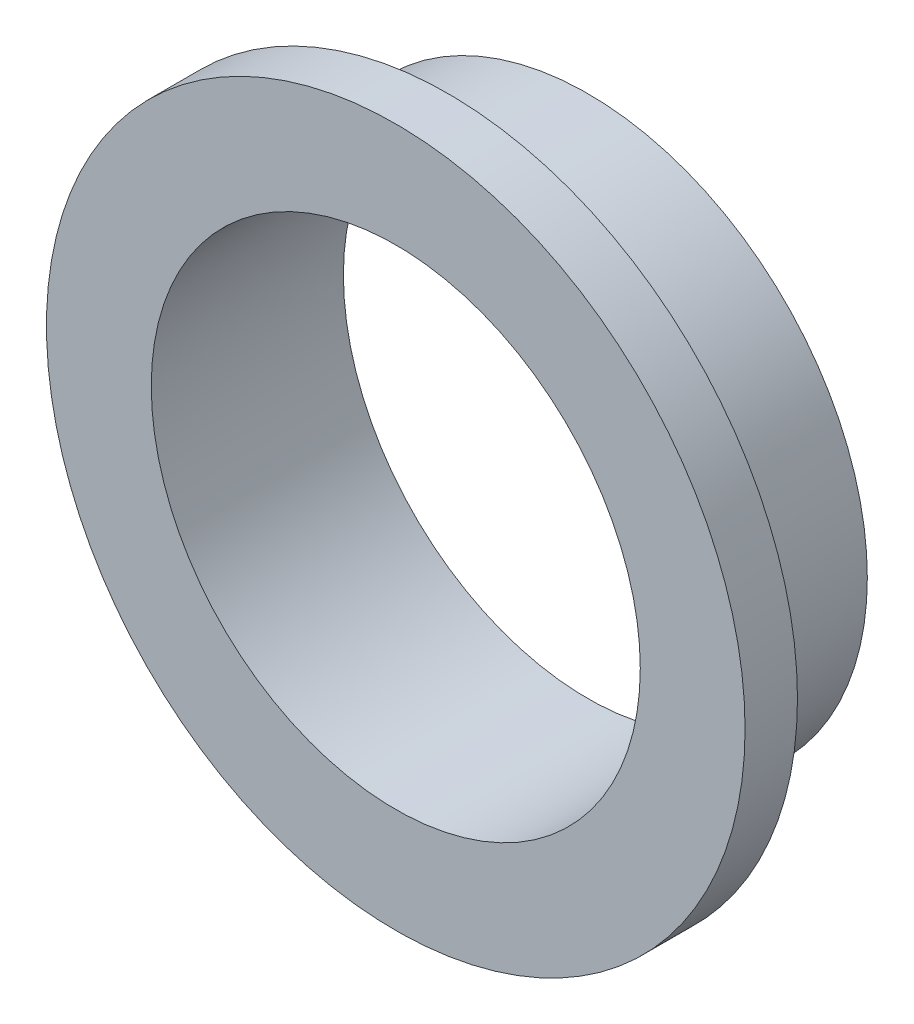
ISO-10303-21;
HEADER;
FILE_DESCRIPTION(('STEP AP214'),'2;1');
FILE_NAME('part.step','',(''),(''),'','','');
FILE_SCHEMA(('AUTOMOTIVE_DESIGN { 1 0 10303 214 1 1 1 1 }'));
ENDSEC;
DATA;
#1=APPLICATION_CONTEXT('core data for automotive mechanical design processes');
#2=APPLICATION_PROTOCOL_DEFINITION('international standard','automotive_design',2000,#1);
#3=PRODUCT_CONTEXT('',#1,'mechanical');
#4=PRODUCT('Part','Part','',(#3));
#5=PRODUCT_RELATED_PRODUCT_CATEGORY('part','',(#4));
#6=PRODUCT_DEFINITION_FORMATION('','',#4);
#7=PRODUCT_DEFINITION_CONTEXT('part definition',#1,'design');
#8=PRODUCT_DEFINITION('design','',#6,#7);
#9=PRODUCT_DEFINITION_SHAPE('','',#8);
#10=(LENGTH_UNIT() NAMED_UNIT(*) SI_UNIT(.MILLI.,.METRE.));
#11=(NAMED_UNIT(*) PLANE_ANGLE_UNIT() SI_UNIT($,.RADIAN.));
#12=(NAMED_UNIT(*) SI_UNIT($,.STERADIAN.) SOLID_ANGLE_UNIT());
#13=UNCERTAINTY_MEASURE_WITH_UNIT(LENGTH_MEASURE(1.E-05),#10,'distance_accuracy_value','');
#14=(GEOMETRIC_REPRESENTATION_CONTEXT(3) GLOBAL_UNCERTAINTY_ASSIGNED_CONTEXT((#13)) GLOBAL_UNIT_ASSIGNED_CONTEXT((#10,
#11,#12)) REPRESENTATION_CONTEXT('',''));
#15=CARTESIAN_POINT('',(0.,0.,0.));
#16=DIRECTION('',(0.,0.,1.));
#17=DIRECTION('',(1.,0.,0.));
#18=AXIS2_PLACEMENT_3D('',#15,#16,#17);
#19=CARTESIAN_POINT('',(0.,0.,0.));
#20=DIRECTION('',(0.,0.,1.));
#21=DIRECTION('',(1.,0.,0.));
#22=AXIS2_PLACEMENT_3D('',#19,#20,#21);
#23=PLANE('',#22);
#24=CARTESIAN_POINT('',(0.,0.,0.));
#25=DIRECTION('',(0.,0.,1.));
#26=DIRECTION('',(1.,0.,0.));
#27=AXIS2_PLACEMENT_3D('',#24,#25,#26);
#28=CIRCLE('',#27,16.);
#29=CARTESIAN_POINT('',(16.,0.,0.));
#30=VERTEX_POINT('',#29);
#31=EDGE_CURVE('E41',#30,#30,#28,.T.);
#32=ORIENTED_EDGE('',*,*,#31,.F.);
#33=EDGE_LOOP('',(#32));
#34=FACE_BOUND('',#33,.T.);
#35=CARTESIAN_POINT('',(0.,0.,0.));
#36=DIRECTION('',(0.,0.,1.));
#37=DIRECTION('',(1.,0.,0.));
#38=AXIS2_PLACEMENT_3D('',#35,#36,#37);
#39=CIRCLE('',#38,14.);
#40=CARTESIAN_POINT('',(14.,0.,0.));
#41=VERTEX_POINT('',#40);
#42=EDGE_CURVE('E50',#41,#41,#39,.T.);
#43=ORIENTED_EDGE('',*,*,#42,.T.);
#44=EDGE_LOOP('',(#43));
#45=FACE_BOUND('',#44,.T.);
#46=ADVANCED_FACE('F37',(#34,#45),#23,.F.);
#47=CARTESIAN_POINT('',(0.,0.,8.));
#48=DIRECTION('',(0.,0.,-1.));
#49=DIRECTION('',(-1.,0.,0.));
#50=AXIS2_PLACEMENT_3D('',#47,#48,#49);
#51=CYLINDRICAL_SURFACE('',#50,16.);
#52=CARTESIAN_POINT('',(0.,0.,8.));
#53=DIRECTION('',(0.,0.,1.));
#54=DIRECTION('',(1.,0.,0.));
#55=AXIS2_PLACEMENT_3D('',#52,#53,#54);
#56=CIRCLE('',#55,16.);
#57=CARTESIAN_POINT('',(16.,0.,8.));
#58=VERTEX_POINT('',#57);
#59=EDGE_CURVE('E10',#58,#58,#56,.T.);
#60=ORIENTED_EDGE('',*,*,#59,.F.);
#61=EDGE_LOOP('',(#60));
#62=FACE_BOUND('',#61,.T.);
#63=ORIENTED_EDGE('',*,*,#31,.T.);
#64=EDGE_LOOP('',(#63));
#65=FACE_BOUND('',#64,.T.);
#66=ADVANCED_FACE('F39',(#62,#65),#51,.T.);
#67=CARTESIAN_POINT('',(0.,0.,8.));
#68=DIRECTION('',(0.,0.,-1.));
#69=DIRECTION('',(-1.,0.,0.));
#70=AXIS2_PLACEMENT_3D('',#67,#68,#69);
#71=CYLINDRICAL_SURFACE('',#70,14.);
#72=ORIENTED_EDGE('',*,*,#42,.F.);
#73=EDGE_LOOP('',(#72));
#74=FACE_BOUND('',#73,.T.);
#75=CARTESIAN_POINT('',(0.,0.,11.));
#76=DIRECTION('',(0.,0.,1.));
#77=DIRECTION('',(1.,0.,0.));
#78=AXIS2_PLACEMENT_3D('',#75,#76,#77);
#79=CIRCLE('',#78,14.);
#80=CARTESIAN_POINT('',(14.,0.,11.));
#81=VERTEX_POINT('',#80);
#82=EDGE_CURVE('E60',#81,#81,#79,.T.);
#83=ORIENTED_EDGE('',*,*,#82,.T.);
#84=EDGE_LOOP('',(#83));
#85=FACE_BOUND('',#84,.T.);
#86=ADVANCED_FACE('F68',(#74,#85),#71,.F.);
#87=CARTESIAN_POINT('',(0.,0.,11.));
#88=DIRECTION('',(0.,0.,1.));
#89=DIRECTION('',(1.,0.,0.));
#90=AXIS2_PLACEMENT_3D('',#87,#88,#89);
#91=PLANE('',#90);
#92=CARTESIAN_POINT('',(0.,0.,11.));
#93=DIRECTION('',(0.,0.,1.));
#94=DIRECTION('',(1.,0.,0.));
#95=AXIS2_PLACEMENT_3D('',#92,#93,#94);
#96=CIRCLE('',#95,20.);
#97=CARTESIAN_POINT('',(20.,0.,11.));
#98=VERTEX_POINT('',#97);
#99=EDGE_CURVE('E55',#98,#98,#96,.T.);
#100=ORIENTED_EDGE('',*,*,#99,.T.);
#101=EDGE_LOOP('',(#100));
#102=FACE_BOUND('',#101,.T.);
#103=ORIENTED_EDGE('',*,*,#82,.F.);
#104=EDGE_LOOP('',(#103));
#105=FACE_BOUND('',#104,.T.);
#106=ADVANCED_FACE('F70',(#102,#105),#91,.T.);
#107=CARTESIAN_POINT('',(0.,0.,8.));
#108=DIRECTION('',(0.,0.,1.));
#109=DIRECTION('',(1.,0.,0.));
#110=AXIS2_PLACEMENT_3D('',#107,#108,#109);
#111=PLANE('',#110);
#112=ORIENTED_EDGE('',*,*,#59,.T.);
#113=EDGE_LOOP('',(#112));
#114=FACE_BOUND('',#113,.T.);
#115=CARTESIAN_POINT('',(0.,0.,8.));
#116=DIRECTION('',(0.,0.,1.));
#117=DIRECTION('',(1.,0.,0.));
#118=AXIS2_PLACEMENT_3D('',#115,#116,#117);
#119=CIRCLE('',#118,20.);
#120=CARTESIAN_POINT('',(20.,0.,8.));
#121=VERTEX_POINT('',#120);
#122=EDGE_CURVE('E56',#121,#121,#119,.T.);
#123=ORIENTED_EDGE('',*,*,#122,.F.);
#124=EDGE_LOOP('',(#123));
#125=FACE_BOUND('',#124,.T.);
#126=ADVANCED_FACE('F72',(#114,#125),#111,.F.);
#127=CARTESIAN_POINT('',(0.,0.,11.));
#128=DIRECTION('',(0.,0.,-1.));
#129=DIRECTION('',(-1.,0.,0.));
#130=AXIS2_PLACEMENT_3D('',#127,#128,#129);
#131=CYLINDRICAL_SURFACE('',#130,20.);
#132=ORIENTED_EDGE('',*,*,#99,.F.);
#133=EDGE_LOOP('',(#132));
#134=FACE_BOUND('',#133,.T.);
#135=ORIENTED_EDGE('',*,*,#122,.T.);
#136=EDGE_LOOP('',(#135));
#137=FACE_BOUND('',#136,.T.);
#138=ADVANCED_FACE('F79',(#134,#137),#131,.T.);
#139=CLOSED_SHELL('',(#46,#66,#86,#106,#126,#138));
#140=MANIFOLD_SOLID_BREP('B2',#139);
#141=ADVANCED_BREP_SHAPE_REPRESENTATION('',(#18,#140),#14);
#142=SHAPE_DEFINITION_REPRESENTATION(#9,#141);
ENDSEC;
END-ISO-10303-21;
